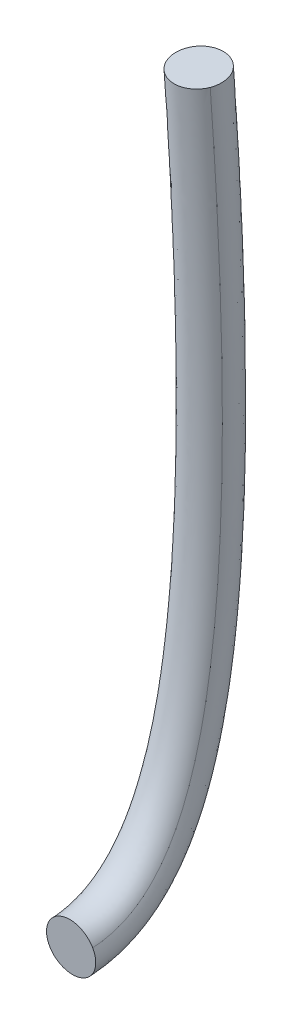
ISO-10303-21;
HEADER;
FILE_DESCRIPTION(('STEP AP214'),'2;1');
FILE_NAME('part.step','',(''),(''),'','','');
FILE_SCHEMA(('AUTOMOTIVE_DESIGN { 1 0 10303 214 1 1 1 1 }'));
ENDSEC;
DATA;
#1=APPLICATION_CONTEXT('core data for automotive mechanical design processes');
#2=APPLICATION_PROTOCOL_DEFINITION('international standard','automotive_design',2000,#1);
#3=PRODUCT_CONTEXT('',#1,'mechanical');
#4=PRODUCT('Part','Part','',(#3));
#5=PRODUCT_RELATED_PRODUCT_CATEGORY('part','',(#4));
#6=PRODUCT_DEFINITION_FORMATION('','',#4);
#7=PRODUCT_DEFINITION_CONTEXT('part definition',#1,'design');
#8=PRODUCT_DEFINITION('design','',#6,#7);
#9=PRODUCT_DEFINITION_SHAPE('','',#8);
#10=(LENGTH_UNIT() NAMED_UNIT(*) SI_UNIT(.MILLI.,.METRE.));
#11=(NAMED_UNIT(*) PLANE_ANGLE_UNIT() SI_UNIT($,.RADIAN.));
#12=(NAMED_UNIT(*) SI_UNIT($,.STERADIAN.) SOLID_ANGLE_UNIT());
#13=UNCERTAINTY_MEASURE_WITH_UNIT(LENGTH_MEASURE(1.E-05),#10,'distance_accuracy_value','');
#14=(GEOMETRIC_REPRESENTATION_CONTEXT(3) GLOBAL_UNCERTAINTY_ASSIGNED_CONTEXT((#13)) GLOBAL_UNIT_ASSIGNED_CONTEXT((#10,
#11,#12)) REPRESENTATION_CONTEXT('',''));
#15=CARTESIAN_POINT('',(0.,0.,0.));
#16=DIRECTION('',(0.,0.,1.));
#17=DIRECTION('',(1.,0.,0.));
#18=AXIS2_PLACEMENT_3D('',#15,#16,#17);
#19=CARTESIAN_POINT('',(5.28287635083713,-7.28809491757742,11.1726740122056));
#20=CARTESIAN_POINT('',(5.28287635083723,-7.28391223465372,11.0968550316426));
#21=CARTESIAN_POINT('',(5.28287635083738,-7.25716150475299,10.9541600356226));
#22=CARTESIAN_POINT('',(5.28287635083751,-7.13144957125908,10.6996019294055));
#23=CARTESIAN_POINT('',(5.2828763508374,-6.82482737652431,10.4240611956267));
#24=CARTESIAN_POINT('',(5.28287635083701,-6.16587502707461,10.177094997557));
#25=CARTESIAN_POINT('',(5.28287635083652,-5.06029873879901,10.0061298463486));
#26=CARTESIAN_POINT('',(5.28287635083623,-3.38305669987009,9.96226559975607));
#27=CARTESIAN_POINT('',(5.28287635083668,-1.8408728225127,10.0365899031701));
#28=CARTESIAN_POINT('',(5.28287635083713,-1.00711974549597,10.0974834079294));
#29=CARTESIAN_POINT('',(5.25375283883113,-7.22774576744087,11.1760032756415));
#30=CARTESIAN_POINT('',(5.25375283883123,-7.22383970341479,11.1051985319223));
#31=CARTESIAN_POINT('',(5.25375283883138,-7.1989259679415,10.9732426564287));
#32=CARTESIAN_POINT('',(5.25375283883151,-7.08368858327068,10.7396368614849));
#33=CARTESIAN_POINT('',(5.2537528388314,-6.79660785516865,10.4790061381246));
#34=CARTESIAN_POINT('',(5.25375283883102,-6.15268444206226,10.2363600208249));
#35=CARTESIAN_POINT('',(5.25375283883052,-5.05654867411845,10.0666581674047));
#36=CARTESIAN_POINT('',(5.25375283883023,-3.38435329052403,10.022700291009));
#37=CARTESIAN_POINT('',(5.25375283883069,-1.84433493998575,10.0969389453076));
#38=CARTESIAN_POINT('',(5.25375283883113,-1.01152234633362,10.157763761471));
#39=CARTESIAN_POINT('',(5.15201509012902,-7.14685077444311,11.1804659854182));
#40=CARTESIAN_POINT('',(5.15201509012912,-7.14331549636338,11.1163824330904));
#41=CARTESIAN_POINT('',(5.15201509012927,-7.12086427574816,10.9988217458234));
#42=CARTESIAN_POINT('',(5.1520150901294,-7.01966729682579,10.7933010404387));
#43=CARTESIAN_POINT('',(5.15201509012929,-6.75878085053194,10.5526565042589));
#44=CARTESIAN_POINT('',(5.15201509012891,-6.1350028768601,10.3158014296783));
#45=CARTESIAN_POINT('',(5.15201509012841,-5.05152172812335,10.1477931261355));
#46=CARTESIAN_POINT('',(5.15201509012812,-3.38609113456095,10.1037098423665));
#47=CARTESIAN_POINT('',(5.15201509012858,-1.84897576021286,10.1778337916164));
#48=CARTESIAN_POINT('',(5.15201509012902,-1.01742381078051,10.2385665361018));
#49=CARTESIAN_POINT('',(4.97452690120175,-7.16764435124932,11.179318872413));
#50=CARTESIAN_POINT('',(4.97452690120185,-7.16401344917686,11.1135019556928));
#51=CARTESIAN_POINT('',(4.974526901202,-7.14093400364115,10.9922385672264));
#52=CARTESIAN_POINT('',(4.97452690120213,-7.03611991172765,10.7794813270785));
#53=CARTESIAN_POINT('',(4.97452690120203,-6.76849756878766,10.5337023142641));
#54=CARTESIAN_POINT('',(4.97452690120165,-6.13953757766622,10.295366528912));
#55=CARTESIAN_POINT('',(4.97452690120116,-5.05280680313447,10.1269295525529));
#56=CARTESIAN_POINT('',(4.97452690120087,-3.38563748309682,10.082882528189));
#57=CARTESIAN_POINT('',(4.97452690120132,-1.8477839382319,10.1570401741301));
#58=CARTESIAN_POINT('',(4.97452690120177,-1.01590687444481,10.2177966634784));
#59=CARTESIAN_POINT('',(4.87405726369888,-7.26777351952273,11.1737950766668));
#60=CARTESIAN_POINT('',(4.87405726369898,-7.26368456818194,11.0996751570164));
#61=CARTESIAN_POINT('',(4.87405726369912,-7.23754359925163,10.9606009945072));
#62=CARTESIAN_POINT('',(4.87405726369925,-7.11537381002069,10.7131305018836));
#63=CARTESIAN_POINT('',(4.87405726369914,-6.81533703948232,10.4426051290044));
#64=CARTESIAN_POINT('',(4.87405726369876,-6.16145235101104,10.1970790862683));
#65=CARTESIAN_POINT('',(4.87405726369827,-5.05904909549647,10.0265270010859));
#66=CARTESIAN_POINT('',(4.87405726369798,-3.38350619185801,9.98262376160797));
#67=CARTESIAN_POINT('',(4.87405726369843,-1.84203663208406,10.056911410264));
#68=CARTESIAN_POINT('',(4.87405726369888,-1.00860223537168,10.1177816400739));
#69=CARTESIAN_POINT('',(4.85500000000068,-7.35208061372048,11.1691441325282));
#70=CARTESIAN_POINT('',(4.85500000000077,-7.34760369485504,11.0879915731232));
#71=CARTESIAN_POINT('',(4.85500000000093,-7.31891954690825,10.933902811644));
#72=CARTESIAN_POINT('',(4.85500000000105,-7.18207751778694,10.6570774741137));
#73=CARTESIAN_POINT('',(4.85500000000094,-6.85472786855344,10.3657368503048));
#74=CARTESIAN_POINT('',(4.85500000000056,-6.17982968949165,10.114213812026));
#75=CARTESIAN_POINT('',(4.85500000000007,-5.06425353034518,9.94192920061354));
#76=CARTESIAN_POINT('',(4.85499999999978,-3.38166110072168,9.89817631631086));
#77=CARTESIAN_POINT('',(4.85500000000023,-1.83720530777412,9.97260408602737));
#78=CARTESIAN_POINT('',(4.85500000000068,-1.00245185077312,10.0335706539573));
#79=CARTESIAN_POINT('',(4.855,-7.38568943191456,11.1672900449514));
#80=CARTESIAN_POINT('',(4.85500000000009,-7.3810594674981,11.0833632476063));
#81=CARTESIAN_POINT('',(4.85500000000025,-7.35133716012293,10.9233017757834));
#82=CARTESIAN_POINT('',(4.85500000000037,-7.2086876159941,10.6348634689714));
#83=CARTESIAN_POINT('',(4.85500000000026,-6.8704641577436,10.3352102792063));
#84=CARTESIAN_POINT('',(4.85499999999988,-6.18720821855255,10.0812563874928));
#85=CARTESIAN_POINT('',(4.85499999999939,-5.06636448381992,9.90824707980005));
#86=CARTESIAN_POINT('',(4.8549999999991,-3.38096115004763,9.86453352367962));
#87=CARTESIAN_POINT('',(4.85499999999955,-1.83527381521949,9.93899557759439));
#88=CARTESIAN_POINT('',(4.855,-1.00000001490137,10.0000001490162));
#89=B_SPLINE_SURFACE_WITH_KNOTS('',3,3,((#19,#20,#21,#22,#23,#24,#25,#26,#27,#28),(#29,#30,#31,
#32,#33,#34,#35,#36,#37,#38),(#39,#40,#41,#42,#43,#44,#45,#46,#47,#48),(#49,#50,#51,#52,#53,#54,
#55,#56,#57,#58),(#59,#60,#61,#62,#63,#64,#65,#66,#67,#68),(#69,#70,#71,#72,#73,#74,#75,#76,#77,
#78),(#79,#80,#81,#82,#83,#84,#85,#86,#87,#88)),.UNSPECIFIED.,.F.,.F.,.F.,(4,1,1,1,4),(4,1,1,1,
1,1,1,4),(0.448798950512828,1.34639685153848,2.01959527730772,2.69279370307697,
3.14159265358979),(0.,0.0714285714285714,0.142857142857143,0.285714285714286,0.428571428571429,
0.571428571428571,0.785714285714286,1.),.UNSPECIFIED.);
#90=CARTESIAN_POINT('',(4.855,-7.38568943191456,11.1672900449514));
#91=CARTESIAN_POINT('',(4.85500000000009,-7.3810594674981,11.0833632476063));
#92=CARTESIAN_POINT('',(4.85500000000025,-7.35133716012293,10.9233017757834));
#93=CARTESIAN_POINT('',(4.85500000000037,-7.2086876159941,10.6348634689714));
#94=CARTESIAN_POINT('',(4.85500000000026,-6.8704641577436,10.3352102792063));
#95=CARTESIAN_POINT('',(4.85499999999988,-6.18720821855255,10.0812563874928));
#96=CARTESIAN_POINT('',(4.85499999999939,-5.06636448381992,9.90824707980005));
#97=CARTESIAN_POINT('',(4.8549999999991,-3.38096115004763,9.86453352367962));
#98=CARTESIAN_POINT('',(4.85499999999955,-1.83527381521949,9.93899557759439));
#99=CARTESIAN_POINT('',(4.855,-1.00000001490137,10.0000001490162));
#100=B_SPLINE_CURVE_WITH_KNOTS('',3,(#90,#91,#92,#93,#94,#95,#96,#97,#98,#99),.UNSPECIFIED.,.F.,
.F.,(4,1,1,1,1,1,1,4),(0.,0.0714285714285714,0.142857142857143,0.285714285714286,
0.428571428571429,0.571428571428571,0.785714285714286,1.),.UNSPECIFIED.);
#101=CARTESIAN_POINT('',(4.855,-7.38568943191456,11.1672900449514));
#102=VERTEX_POINT('',#101);
#103=CARTESIAN_POINT('',(4.855,-1.00000001490137,10.0000001490162));
#104=VERTEX_POINT('',#103);
#105=EDGE_CURVE('E11',#102,#104,#100,.T.);
#106=CARTESIAN_POINT('',(4.855,-7.38568943191456,11.1672900449514));
#107=CARTESIAN_POINT('',(4.85500898302552,-7.39838155306187,11.1665898625169));
#108=CARTESIAN_POINT('',(4.85613096236451,-7.41108367347833,11.1658891284558));
#109=CARTESIAN_POINT('',(4.86051204882248,-7.43613037585764,11.16450738455));
#110=CARTESIAN_POINT('',(4.86377545146241,-7.4484741870021,11.1638264172288));
#111=CARTESIAN_POINT('',(4.87228003623044,-7.4724346749237,11.1625045961897));
#112=CARTESIAN_POINT('',(4.87751719922159,-7.48405277378617,11.16186366402));
#113=CARTESIAN_POINT('',(4.88983538338313,-7.50626183267038,11.1606384635405));
#114=CARTESIAN_POINT('',(4.89691534044921,-7.51685338063631,11.1600541627957));
#115=CARTESIAN_POINT('',(4.91289394166623,-7.53685858335404,11.1589505417872));
#116=CARTESIAN_POINT('',(4.92182001347949,-7.54625054577946,11.1584324182175));
#117=CARTESIAN_POINT('',(4.94122198670529,-7.5632664804094,11.1574937052636));
#118=CARTESIAN_POINT('',(4.95169701242292,-7.57089144536647,11.1570730611125));
#119=CARTESIAN_POINT('',(4.97322146920697,-7.58382886121968,11.1563593465787));
#120=CARTESIAN_POINT('',(4.98421001950781,-7.5892433551606,11.1560606468181));
#121=CARTESIAN_POINT('',(5.00691453865166,-7.59828252377608,11.1555619857186));
#122=CARTESIAN_POINT('',(5.01863139180586,-7.6019049727886,11.1553621471621));
#123=CARTESIAN_POINT('',(5.04315197144767,-7.6074317536495,11.1550572529027));
#124=CARTESIAN_POINT('',(5.05597992171012,-7.60922950401815,11.1549580769482));
#125=CARTESIAN_POINT('',(5.0817449155164,-7.6106588795768,11.1548792230162));
#126=CARTESIAN_POINT('',(5.09468179650826,-7.61029330328946,11.1548993906534));
#127=CARTESIAN_POINT('',(5.12025693334194,-7.60727016815752,11.1550661670411));
#128=CARTESIAN_POINT('',(5.13289589266777,-7.6046187153354,11.1552124389424));
#129=CARTESIAN_POINT('',(5.15749232927867,-7.59709040237273,11.1556277511221));
#130=CARTESIAN_POINT('',(5.16944941881424,-7.59221228994801,11.1558968604847));
#131=CARTESIAN_POINT('',(5.19179107759135,-7.58083364739698,11.1565245826401));
#132=CARTESIAN_POINT('',(5.20222464433374,-7.57442795005753,11.1568779638209));
#133=CARTESIAN_POINT('',(5.22197518288573,-7.56007447792306,11.1576697975062));
#134=CARTESIAN_POINT('',(5.23129150813286,-7.55212581709529,11.1581082988902));
#135=CARTESIAN_POINT('',(5.24922090494611,-7.5342102575488,11.1590966411816));
#136=CARTESIAN_POINT('',(5.25772761490986,-7.52413622904336,11.1596523920859));
#137=CARTESIAN_POINT('',(5.27280933342445,-7.50266545107726,11.1608368640438));
#138=CARTESIAN_POINT('',(5.27938727955828,-7.49127075037768,11.1614654720742));
#139=CARTESIAN_POINT('',(5.29512994985696,-7.45681958492733,11.163366029169));
#140=CARTESIAN_POINT('',(5.30142284448711,-7.43237564198297,11.1647145208261));
#141=CARTESIAN_POINT('',(5.30492556747938,-7.39526846280032,11.1667616014327));
#142=CARTESIAN_POINT('',(5.30508857064322,-7.38275869250212,11.1674517241726));
#143=CARTESIAN_POINT('',(5.30342251733357,-7.35785766184776,11.1688254318501));
#144=CARTESIAN_POINT('',(5.30159454983397,-7.34546634044306,11.1695090201555));
#145=CARTESIAN_POINT('',(5.29578604292139,-7.32053758342812,11.1708842574048));
#146=CARTESIAN_POINT('',(5.29170260203802,-7.3080237332634,11.1715746052176));
#147=CARTESIAN_POINT('',(5.28127896339499,-7.28397362860862,11.1729013701161));
#148=CARTESIAN_POINT('',(5.27494012711353,-7.27243678953215,11.1735378194516));
#149=CARTESIAN_POINT('',(5.26083945130555,-7.25147194057074,11.1746943809761));
#150=CARTESIAN_POINT('',(5.25321317381539,-7.24195185510501,11.1752195726711));
#151=CARTESIAN_POINT('',(5.23655167901211,-7.22421356129871,11.1761981357966));
#152=CARTESIAN_POINT('',(5.22751466212768,-7.2159970431904,11.1766514139827));
#153=CARTESIAN_POINT('',(5.20769999790238,-7.20061557641174,11.1774999587397));
#154=CARTESIAN_POINT('',(5.1968507349286,-7.1935424111452,11.1778901619231));
#155=CARTESIAN_POINT('',(5.17413462553926,-7.18130501287186,11.1785652587974));
#156=CARTESIAN_POINT('',(5.16226918801171,-7.17613818794327,11.178850295476));
#157=CARTESIAN_POINT('',(5.13780073491028,-7.1679881135619,11.1792999081809));
#158=CARTESIAN_POINT('',(5.12519767843004,-7.16500498533523,11.1794644775197));
#159=CARTESIAN_POINT('',(5.09965309482426,-7.16133299831786,11.1796670489243));
#160=CARTESIAN_POINT('',(5.08671125212495,-7.16064636129739,11.1797049284225));
#161=CARTESIAN_POINT('',(5.0615332771148,-7.16143866037071,11.1796612198975));
#162=CARTESIAN_POINT('',(5.04929346340279,-7.16281378933294,11.1795853585712));
#163=CARTESIAN_POINT('',(5.02519364706934,-7.16748733198114,11.1793275346479));
#164=CARTESIAN_POINT('',(5.01333339826963,-7.17078447128152,11.1791456423546));
#165=CARTESIAN_POINT('',(4.98976076088942,-7.17948509864092,11.1786656574588));
#166=CARTESIAN_POINT('',(4.97808258975953,-7.18498180792048,11.1783624221492));
#167=CARTESIAN_POINT('',(4.95585577585179,-7.19791838711838,11.1776487537709));
#168=CARTESIAN_POINT('',(4.94530777359479,-7.2053593508106,11.1772382603622));
#169=CARTESIAN_POINT('',(4.92584664313783,-7.22169576696802,11.1763370341997));
#170=CARTESIAN_POINT('',(4.91690032960921,-7.23055198716923,11.1758484657604));
#171=CARTESIAN_POINT('',(4.90057787118176,-7.24960583529697,11.1747973278448));
#172=CARTESIAN_POINT('',(4.89320127733235,-7.25980307832813,11.1742347796018));
#173=CARTESIAN_POINT('',(4.88015541648163,-7.28152208401905,11.1730366137395));
#174=CARTESIAN_POINT('',(4.87452413260132,-7.29306666108335,11.1723997375248));
#175=CARTESIAN_POINT('',(4.86535163255297,-7.31694709863192,11.1710823326005));
#176=CARTESIAN_POINT('',(4.86180871523507,-7.32928230597384,11.1704018399227));
#177=CARTESIAN_POINT('',(4.85789275201526,-7.34903790148391,11.1693119889201));
#178=CARTESIAN_POINT('',(4.85681267968869,-7.35632684106166,11.1689098821801));
#179=CARTESIAN_POINT('',(4.85536385970591,-7.37097256498206,11.1681019259283));
#180=CARTESIAN_POINT('',(4.85499479077628,-7.37832931717231,11.1676960781903));
#181=CARTESIAN_POINT('',(4.855,-7.38568943191456,11.1672900449514));
#182=B_SPLINE_CURVE_WITH_KNOTS('',3,(#106,#107,#108,#109,#110,#111,#112,#113,#114,#115,#116,
#117,#118,#119,#120,#121,#122,#123,#124,#125,#126,#127,#128,#129,#130,#131,#132,#133,#134,#135,
#136,#137,#138,#139,#140,#141,#142,#143,#144,#145,#146,#147,#148,#149,#150,#151,#152,#153,#154,
#155,#156,#157,#158,#159,#160,#161,#162,#163,#164,#165,#166,#167,#168,#169,#170,#171,#172,#173,
#174,#175,#176,#177,#178,#179,#180,#181),.UNSPECIFIED.,.T.,.F.,(4,2,2,2,2,2,2,2,2,2,2,2,2,2,2,2,
2,2,2,2,2,2,2,2,2,2,2,2,2,2,2,2,2,2,2,2,2,4),(0.,0.0381074791580151,0.0762916334552469,
0.114398450427816,0.152483311602724,0.191180908010574,0.229856709942464,0.266459527422844,
0.303107691004849,0.341791001757466,0.380424281953728,0.418954683738685,0.457506781958837,
0.494103613770385,0.530721523482549,0.570106870961588,0.609431917664703,0.683599187580616,
0.721080321794653,0.758540965757732,0.797871652429693,0.837178637147972,0.873651392624372,
0.910171059598914,0.948865922555236,0.987507979143109,1.02615218074996,1.0648337583933,
1.10163205538872,1.13840598104546,1.17693916196726,1.21549406724301,1.25312283470594,
1.2907408255758,1.32912779309234,1.36748344783412,1.3895918281717,1.41169021628869),.UNSPECIFIED.);
#183=CARTESIAN_POINT('',(5.28287635083713,-7.28809491757742,11.1726740122056));
#184=VERTEX_POINT('',#183);
#185=EDGE_CURVE('E45',#184,#102,#182,.T.);
#186=CARTESIAN_POINT('',(5.28287635083713,-7.28809491757742,11.1726740122056));
#187=CARTESIAN_POINT('',(5.28287635083723,-7.28391223465372,11.0968550316426));
#188=CARTESIAN_POINT('',(5.28287635083738,-7.25716150475299,10.9541600356226));
#189=CARTESIAN_POINT('',(5.28287635083751,-7.13144957125908,10.6996019294055));
#190=CARTESIAN_POINT('',(5.2828763508374,-6.82482737652431,10.4240611956267));
#191=CARTESIAN_POINT('',(5.28287635083701,-6.16587502707461,10.177094997557));
#192=CARTESIAN_POINT('',(5.28287635083652,-5.06029873879901,10.0061298463486));
#193=CARTESIAN_POINT('',(5.28287635083623,-3.38305669987009,9.96226559975607));
#194=CARTESIAN_POINT('',(5.28287635083668,-1.8408728225127,10.0365899031701));
#195=CARTESIAN_POINT('',(5.28287635083713,-1.00711974549597,10.0974834079294));
#196=B_SPLINE_CURVE_WITH_KNOTS('',3,(#186,#187,#188,#189,#190,#191,#192,#193,#194,#195),
.UNSPECIFIED.,.F.,.F.,(4,1,1,1,1,1,1,4),(0.,0.0714285714285714,0.142857142857143,
0.285714285714286,0.428571428571429,0.571428571428571,0.785714285714286,1.),.UNSPECIFIED.);
#197=CARTESIAN_POINT('',(5.28287635083713,-1.00711974549597,10.0974834079294));
#198=VERTEX_POINT('',#197);
#199=EDGE_CURVE('E29',#184,#198,#196,.T.);
#200=CARTESIAN_POINT('',(4.855,-1.00000001490137,10.0000001490162));
#201=CARTESIAN_POINT('',(4.85498685270043,-1.00091767378516,10.0125647225457));
#202=CARTESIAN_POINT('',(4.85606436609906,-1.00183518192052,10.0251272320294));
#203=CARTESIAN_POINT('',(4.8602667108712,-1.0036458740971,10.0499192058156));
#204=CARTESIAN_POINT('',(4.86339371031958,-1.00453903133506,10.0621483031283));
#205=CARTESIAN_POINT('',(4.87167862388791,-1.00627464036471,10.0859122394411));
#206=CARTESIAN_POINT('',(4.87683719811431,-1.00711707557295,10.097446851381));
#207=CARTESIAN_POINT('',(4.88906499697249,-1.00872463038883,10.1194574710605));
#208=CARTESIAN_POINT('',(4.89613422720086,-1.00948974976999,10.1299334756992));
#209=CARTESIAN_POINT('',(4.91182005230023,-1.01091683370963,10.1494730904829));
#210=CARTESIAN_POINT('',(4.92041945942985,-1.01157980529872,10.1585504888781));
#211=CARTESIAN_POINT('',(4.93897765207323,-1.01279535251612,10.1751937456058));
#212=CARTESIAN_POINT('',(4.94893596475714,-1.01334796637925,10.182760127449));
#213=CARTESIAN_POINT('',(4.97028645285262,-1.01433883291976,10.1963270592641));
#214=CARTESIAN_POINT('',(4.98171174124332,-1.01477332043702,10.2022760567125));
#215=CARTESIAN_POINT('',(5.0054296259462,-1.01549129362526,10.2121065362894));
#216=CARTESIAN_POINT('',(5.01772277767224,-1.01577468158535,10.2159866805616));
#217=CARTESIAN_POINT('',(5.04250820418292,-1.01618397090928,10.2215906646738));
#218=CARTESIAN_POINT('',(5.05499037193594,-1.01631315576034,10.2233594619782));
#219=CARTESIAN_POINT('',(5.0800718838087,-1.01642109391983,10.2248373498571));
#220=CARTESIAN_POINT('',(5.09267113861513,-1.01639995377551,10.2245478992753));
#221=CARTESIAN_POINT('',(5.11787567658593,-1.01619854275641,10.2217901822151));
#222=CARTESIAN_POINT('',(5.13047659393569,-1.01601527888421,10.2192809356548));
#223=CARTESIAN_POINT('',(5.15502521933214,-1.01548787200074,10.2120596874497));
#224=CARTESIAN_POINT('',(5.16697279591923,-1.01514369674434,10.207347244305));
#225=CARTESIAN_POINT('',(5.18942268575408,-1.01433314281304,10.1962491503951));
#226=CARTESIAN_POINT('',(5.19996472628854,-1.01387253885886,10.1899425670312));
#227=CARTESIAN_POINT('',(5.21994072440755,-1.01283689800492,10.1757625858972));
#228=CARTESIAN_POINT('',(5.22937383608525,-1.01226177463742,10.1678880042121));
#229=CARTESIAN_POINT('',(5.24750009497124,-1.01096640315271,10.1501517946518));
#230=CARTESIAN_POINT('',(5.25609521442473,-1.01023881415686,10.1401896555618));
#231=CARTESIAN_POINT('',(5.27138700980934,-1.00868666051376,10.118937588021));
#232=CARTESIAN_POINT('',(5.27808659597397,-1.00786224730637,10.1076497330829));
#233=CARTESIAN_POINT('',(5.29428727484046,-1.00535574484789,10.0733307339452));
#234=CARTESIAN_POINT('',(5.30089837784991,-1.00356848656061,10.048859616667));
#235=CARTESIAN_POINT('',(5.30481275615341,-1.00085472619333,10.0117028449316));
#236=CARTESIAN_POINT('',(5.30510900678263,-0.999941892777852,9.99920434165181));
#237=CARTESIAN_POINT('',(5.30370634008788,-0.998123290466656,9.9743040624049));
#238=CARTESIAN_POINT('',(5.30200840781055,-0.997217518305352,9.96190224172551));
#239=CARTESIAN_POINT('',(5.29646025997511,-0.995394245479137,9.93693801384761));
#240=CARTESIAN_POINT('',(5.29250805139265,-0.994478368548647,9.92439783879972));
#241=CARTESIAN_POINT('',(5.28233219921365,-0.992716453568648,9.90027372175606));
#242=CARTESIAN_POINT('',(5.27611018344714,-0.991870366000388,9.8886891017502));
#243=CARTESIAN_POINT('',(5.26223066023801,-0.990333987868007,9.86765303229762));
#244=CARTESIAN_POINT('',(5.25471573051755,-0.989636772784244,9.85810677241781));
#245=CARTESIAN_POINT('',(5.23827243539614,-0.988335827984186,9.84029425309645));
#246=CARTESIAN_POINT('',(5.22934214801278,-0.98773222762955,9.83202976487308));
#247=CARTESIAN_POINT('',(5.20973032480087,-0.986599151740705,9.81651570450582));
#248=CARTESIAN_POINT('',(5.19897536930164,-0.986076404504742,9.80935825613423));
#249=CARTESIAN_POINT('',(5.17643457031887,-0.985168512919508,9.79692741633008));
#250=CARTESIAN_POINT('',(5.16465009786619,-0.984783188935999,9.79165156534786));
#251=CARTESIAN_POINT('',(5.14027304059211,-0.984169230041924,9.78324524813703));
#252=CARTESIAN_POINT('',(5.12767737430885,-0.98394123646882,9.78012356309262));
#253=CARTESIAN_POINT('',(5.10212559078906,-0.983655143278717,9.77620637884623));
#254=CARTESIAN_POINT('',(5.08916928640574,-0.983597133595994,9.7754121110232));
#255=CARTESIAN_POINT('',(5.06405036965103,-0.98363966196249,9.7759944088656));
#256=CARTESIAN_POINT('',(5.05188437206886,-0.983731404949504,9.77725055265346));
#257=CARTESIAN_POINT('',(5.02789143816778,-0.984051716989181,9.78163626094456));
#258=CARTESIAN_POINT('',(5.0160646710557,-0.984280353121366,9.78476674389976));
#259=CARTESIAN_POINT('',(4.99220289457487,-0.984891262746003,9.79313131055337));
#260=CARTESIAN_POINT('',(4.980215410375,-0.985283509719295,9.79850195102201));
#261=CARTESIAN_POINT('',(4.95738335115534,-0.986214100998314,9.81124359473925));
#262=CARTESIAN_POINT('',(4.9465373990559,-0.986752266405863,9.81861214851632));
#263=CARTESIAN_POINT('',(4.91721569339561,-0.988518162976455,9.842790781447));
#264=CARTESIAN_POINT('',(4.90074482141718,-0.989928544774415,9.86210171072383));
#265=CARTESIAN_POINT('',(4.87493254860206,-0.993049838415738,9.90483842275944));
#266=CARTESIAN_POINT('',(4.8655690793125,-0.994759799543639,9.92825118833447));
#267=CARTESIAN_POINT('',(4.85678988512875,-0.99767064890133,9.96810649996925));
#268=CARTESIAN_POINT('',(4.85501668467512,-0.998835453291993,9.9840549865719));
#269=CARTESIAN_POINT('',(4.855,-1.00000001490137,10.0000001490162));
#270=B_SPLINE_CURVE_WITH_KNOTS('',3,(#200,#201,#202,#203,#204,#205,#206,#207,#208,#209,#210,
#211,#212,#213,#214,#215,#216,#217,#218,#219,#220,#221,#222,#223,#224,#225,#226,#227,#228,#229,
#230,#231,#232,#233,#234,#235,#236,#237,#238,#239,#240,#241,#242,#243,#244,#245,#246,#247,#248,
#249,#250,#251,#252,#253,#254,#255,#256,#257,#258,#259,#260,#261,#262,#263,#264,#265,#266,#267,
#268,#269),.UNSPECIFIED.,.T.,.F.,(4,2,2,2,2,2,2,2,2,2,2,2,2,2,2,2,2,2,2,2,2,2,2,2,2,2,2,2,2,2,2,
2,2,2,4),(0.,0.0377492994626856,0.0755385970959536,0.113340183504772,0.151141880640976,
0.188543071837737,0.225931282353478,0.26439964752007,0.302892858779504,0.340550907170823,
0.378182266974694,0.416523190559251,0.454871800599968,0.491600878482137,0.528357794486082,
0.567687837217448,0.606957164302819,0.681503827023151,0.719001155140764,0.756479968864377,
0.795806719716347,0.835105322002457,0.871457906096026,0.907860284885826,0.946473513358503,
0.985036081536474,1.02375493101568,1.06249426198601,1.09903913752121,1.1356019352202,
1.17482663095625,1.21400345239511,1.28872243068049,1.36320844699023,1.41111446709342),.UNSPECIFIED.);
#271=EDGE_CURVE('E48',#104,#198,#270,.T.);
#272=ORIENTED_EDGE('',*,*,#105,.F.);
#273=ORIENTED_EDGE('',*,*,#185,.F.);
#274=ORIENTED_EDGE('',*,*,#199,.T.);
#275=ORIENTED_EDGE('',*,*,#271,.F.);
#276=EDGE_LOOP('',(#272,#273,#274,#275));
#277=FACE_BOUND('',#276,.T.);
#278=ADVANCED_FACE('F17',(#277),#89,.F.);
#279=CARTESIAN_POINT('',(5.08,-1.00000001490116,10.0000001490116));
#280=DIRECTION('',(-5.32623886368089E-13,-0.997343536648528,-0.0728414024124084));
#281=DIRECTION('',(0.,0.0728414024124084,-0.997343536648528));
#282=AXIS2_PLACEMENT_3D('',#279,#280,#281);
#283=PLANE('',#282);
#284=ORIENTED_EDGE('',*,*,#271,.T.);
#285=EDGE_CURVE('E80',#198,#104,#270,.T.);
#286=ORIENTED_EDGE('',*,*,#285,.T.);
#287=EDGE_LOOP('',(#284,#286));
#288=FACE_BOUND('',#287,.T.);
#289=ADVANCED_FACE('F72',(#288),#283,.F.);
#290=CARTESIAN_POINT('',(5.08,-7.38568943191911,11.1672900449514));
#291=DIRECTION('',(-1.11249196396045E-12,-0.0550829445172842,0.998481782118886));
#292=DIRECTION('',(0.,-0.998481782118886,-0.0550829445172842));
#293=AXIS2_PLACEMENT_3D('',#290,#291,#292);
#294=PLANE('',#293);
#295=EDGE_CURVE('E52',#102,#184,#182,.T.);
#296=ORIENTED_EDGE('',*,*,#295,.T.);
#297=ORIENTED_EDGE('',*,*,#185,.T.);
#298=EDGE_LOOP('',(#296,#297));
#299=FACE_BOUND('',#298,.T.);
#300=ADVANCED_FACE('F51',(#299),#294,.T.);
#301=CARTESIAN_POINT('',(4.855,-7.38568943191456,11.1672900449514));
#302=CARTESIAN_POINT('',(4.85500000000009,-7.3810594674981,11.0833632476063));
#303=CARTESIAN_POINT('',(4.85500000000025,-7.35133716012293,10.9233017757834));
#304=CARTESIAN_POINT('',(4.85500000000037,-7.2086876159941,10.6348634689714));
#305=CARTESIAN_POINT('',(4.85500000000026,-6.8704641577436,10.3352102792063));
#306=CARTESIAN_POINT('',(4.85499999999988,-6.18720821855255,10.0812563874928));
#307=CARTESIAN_POINT('',(4.85499999999939,-5.06636448381992,9.90824707980005));
#308=CARTESIAN_POINT('',(4.8549999999991,-3.38096115004763,9.86453352367962));
#309=CARTESIAN_POINT('',(4.85499999999955,-1.83527381521949,9.93899557759439));
#310=CARTESIAN_POINT('',(4.855,-1.00000001490137,10.0000001490162));
#311=CARTESIAN_POINT('',(4.85499999999898,-7.43610265920569,11.1645089135862));
#312=CARTESIAN_POINT('',(4.85499999999908,-7.43123996642441,11.0763634777044));
#313=CARTESIAN_POINT('',(4.85499999999923,-7.40000796882896,10.9073178770832));
#314=CARTESIAN_POINT('',(4.85499999999935,-7.24856596453764,10.6012856369739));
#315=CARTESIAN_POINT('',(4.85499999999924,-6.89400364002222,10.2891921674766));
#316=CARTESIAN_POINT('',(4.85499999999886,-6.19817350039207,10.0316705015669));
#317=CARTESIAN_POINT('',(4.85499999999837,-5.06946012379188,9.85764066067087));
#318=CARTESIAN_POINT('',(4.85499999999808,-3.37984166076282,9.81402638116778));
#319=CARTESIAN_POINT('',(4.85499999999853,-1.8323873202791,9.8885820302603));
#320=CARTESIAN_POINT('',(4.85499999999898,-0.996322261093758,9.94964439160444));
#321=CARTESIAN_POINT('',(4.87867736013233,-7.5028476609968,11.1608268121235));
#322=CARTESIAN_POINT('',(4.87867736013242,-7.49768155306932,11.0671814070851));
#323=CARTESIAN_POINT('',(4.87867736013257,-7.46437995590747,10.8862785325676));
#324=CARTESIAN_POINT('',(4.87867736013269,-7.30141804661997,10.5572125809282));
#325=CARTESIAN_POINT('',(4.87867736013258,-6.92526568611358,10.2286061429005));
#326=CARTESIAN_POINT('',(4.8786773601322,-6.21284378461798,9.96624394418506));
#327=CARTESIAN_POINT('',(4.87867736013171,-5.07366407666715,9.79076387927475));
#328=CARTESIAN_POINT('',(4.87867736013142,-3.37846313122409,9.74722102685625));
#329=CARTESIAN_POINT('',(4.87867736013188,-1.8285497168366,9.82183777367892));
#330=CARTESIAN_POINT('',(4.87867736013232,-0.991453069064883,9.88297547752701));
#331=CARTESIAN_POINT('',(4.97415731282873,-7.59922497581093,11.1555099937502));
#332=CARTESIAN_POINT('',(4.97415731282883,-7.59361574463084,11.0538321478384));
#333=CARTESIAN_POINT('',(4.97415731282897,-7.55740100207643,10.855768127811));
#334=CARTESIAN_POINT('',(4.9741573128291,-7.37767623891556,10.4931661111074));
#335=CARTESIAN_POINT('',(4.97415731282898,-6.97030409303097,10.1407607880639));
#336=CARTESIAN_POINT('',(4.9741573128286,-6.23386483514869,9.87153333024947));
#337=CARTESIAN_POINT('',(4.97415731282811,-5.07962235347012,9.69406449661168));
#338=CARTESIAN_POINT('',(4.97415731282782,-3.37636245236694,9.65068856078149));
#339=CARTESIAN_POINT('',(4.97415731282828,-1.82302536917519,9.72546029260071));
#340=CARTESIAN_POINT('',(4.97415731282872,-0.984422135804534,9.78670803055825));
#341=CARTESIAN_POINT('',(5.13709830660169,-7.63627623414067,11.1534659981128));
#342=CARTESIAN_POINT('',(5.13709830660178,-7.63049818173918,11.0487279506178));
#343=CARTESIAN_POINT('',(5.13709830660193,-7.59314044500834,10.844078664356));
#344=CARTESIAN_POINT('',(5.13709830660206,-7.40701076025823,10.4686686943161));
#345=CARTESIAN_POINT('',(5.13709830660195,-6.98765014863887,10.1071002782185));
#346=CARTESIAN_POINT('',(5.13709830660157,-6.24199588760867,9.83519546008239));
#347=CARTESIAN_POINT('',(5.13709830660108,-5.08194729101963,9.65692980079874));
#348=CARTESIAN_POINT('',(5.13709830660079,-3.3755886128678,9.61359849264991));
#349=CARTESIAN_POINT('',(5.13709830660123,-1.82089637926626,9.68840935099774));
#350=CARTESIAN_POINT('',(5.13709830660168,-0.981719166490393,9.74969900978126));
#351=CARTESIAN_POINT('',(5.31222219806473,-7.49738924769127,11.161127934771));
#352=CARTESIAN_POINT('',(5.31222219806482,-7.49224722564673,11.0679191315789));
#353=CARTESIAN_POINT('',(5.31222219806497,-7.45912582630378,10.8879801766145));
#354=CARTESIAN_POINT('',(5.3122221980651,-7.2970873266926,10.5607577592409));
#355=CARTESIAN_POINT('',(5.31222219806498,-6.92269412086065,10.2335083301475));
#356=CARTESIAN_POINT('',(5.3122221980646,-6.21162044904819,9.97156006276409));
#357=CARTESIAN_POINT('',(5.31222219806411,-5.07330398106453,9.79621390818902));
#358=CARTESIAN_POINT('',(5.31222219806381,-3.37855985407118,9.75267448789973));
#359=CARTESIAN_POINT('',(5.31222219806427,-1.82886602969273,9.82729594540696));
#360=CARTESIAN_POINT('',(5.31222219806472,-0.991851272104211,9.88842766837126));
#361=CARTESIAN_POINT('',(5.31199986284313,-7.34844406771396,11.1693447487697));
#362=CARTESIAN_POINT('',(5.31199986284323,-7.34398476589264,11.0885115313628));
#363=CARTESIAN_POINT('',(5.31199986284338,-7.31539704156448,10.9350774148164));
#364=CARTESIAN_POINT('',(5.31199986284351,-7.17921055924747,10.659566997326));
#365=CARTESIAN_POINT('',(5.31199986284339,-6.85304689787996,10.3691162531287));
#366=CARTESIAN_POINT('',(5.31199986284301,-6.17906561208696,10.1178299742891));
#367=CARTESIAN_POINT('',(5.31199986284252,-5.06404880347956,9.94560152529247));
#368=CARTESIAN_POINT('',(5.31199986284223,-3.38176010921615,9.90183090850309));
#369=CARTESIAN_POINT('',(5.31199986284268,-1.83741070503966,9.97624086103265));
#370=CARTESIAN_POINT('',(5.31199986284313,-1.00271714465833,10.0372030543879));
#371=CARTESIAN_POINT('',(5.28287635083713,-7.28809491757742,11.1726740122056));
#372=CARTESIAN_POINT('',(5.28287635083723,-7.28391223465372,11.0968550316426));
#373=CARTESIAN_POINT('',(5.28287635083738,-7.25716150475299,10.9541600356226));
#374=CARTESIAN_POINT('',(5.28287635083751,-7.13144957125908,10.6996019294055));
#375=CARTESIAN_POINT('',(5.2828763508374,-6.82482737652431,10.4240611956267));
#376=CARTESIAN_POINT('',(5.28287635083701,-6.16587502707461,10.177094997557));
#377=CARTESIAN_POINT('',(5.28287635083652,-5.06029873879901,10.0061298463486));
#378=CARTESIAN_POINT('',(5.28287635083623,-3.38305669987009,9.96226559975607));
#379=CARTESIAN_POINT('',(5.28287635083668,-1.8408728225127,10.0365899031701));
#380=CARTESIAN_POINT('',(5.28287635083713,-1.00711974549597,10.0974834079294));
#381=B_SPLINE_SURFACE_WITH_KNOTS('',3,3,((#301,#302,#303,#304,#305,#306,#307,#308,#309,#310),
(#311,#312,#313,#314,#315,#316,#317,#318,#319,#320),(#321,#322,#323,#324,#325,#326,#327,#328,
#329,#330),(#331,#332,#333,#334,#335,#336,#337,#338,#339,#340),(#341,#342,#343,#344,#345,#346,
#347,#348,#349,#350),(#351,#352,#353,#354,#355,#356,#357,#358,#359,#360),(#361,#362,#363,#364,
#365,#366,#367,#368,#369,#370),(#371,#372,#373,#374,#375,#376,#377,#378,#379,#380)),
.UNSPECIFIED.,.F.,.F.,.F.,(4,1,1,1,1,4),(4,1,1,1,1,1,1,4),(-3.14159265358979,-2.46839422782055,
-2.24399475256414,-1.34639685153848,-0.448798950512828,0.448798950512828),(0.,
0.0714285714285714,0.142857142857143,0.285714285714286,0.428571428571429,0.571428571428571,
0.785714285714286,1.),.UNSPECIFIED.);
#382=ORIENTED_EDGE('',*,*,#295,.F.);
#383=ORIENTED_EDGE('',*,*,#105,.T.);
#384=ORIENTED_EDGE('',*,*,#285,.F.);
#385=ORIENTED_EDGE('',*,*,#199,.F.);
#386=EDGE_LOOP('',(#382,#383,#384,#385));
#387=FACE_BOUND('',#386,.T.);
#388=ADVANCED_FACE('F54',(#387),#381,.F.);
#389=CLOSED_SHELL('',(#278,#289,#300,#388));
#390=MANIFOLD_SOLID_BREP('B1',#389);
#391=ADVANCED_BREP_SHAPE_REPRESENTATION('',(#18,#390),#14);
#392=SHAPE_DEFINITION_REPRESENTATION(#9,#391);
ENDSEC;
END-ISO-10303-21;
